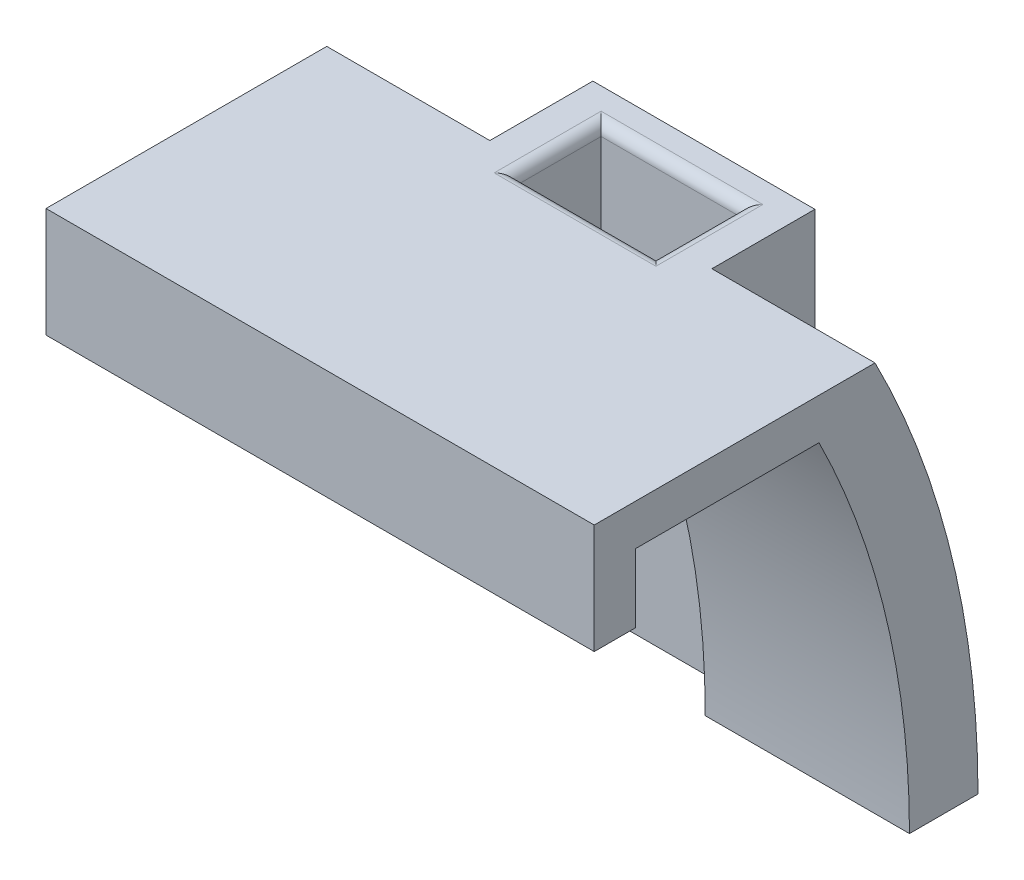
ISO-10303-21;
HEADER;
FILE_DESCRIPTION(('STEP AP214'),'2;1');
FILE_NAME('part.step','',(''),(''),'','','');
FILE_SCHEMA(('AUTOMOTIVE_DESIGN { 1 0 10303 214 1 1 1 1 }'));
ENDSEC;
DATA;
#1=APPLICATION_CONTEXT('core data for automotive mechanical design processes');
#2=APPLICATION_PROTOCOL_DEFINITION('international standard','automotive_design',2000,#1);
#3=PRODUCT_CONTEXT('',#1,'mechanical');
#4=PRODUCT('Part','Part','',(#3));
#5=PRODUCT_RELATED_PRODUCT_CATEGORY('part','',(#4));
#6=PRODUCT_DEFINITION_FORMATION('','',#4);
#7=PRODUCT_DEFINITION_CONTEXT('part definition',#1,'design');
#8=PRODUCT_DEFINITION('design','',#6,#7);
#9=PRODUCT_DEFINITION_SHAPE('','',#8);
#10=(LENGTH_UNIT() NAMED_UNIT(*) SI_UNIT(.MILLI.,.METRE.));
#11=(NAMED_UNIT(*) PLANE_ANGLE_UNIT() SI_UNIT($,.RADIAN.));
#12=(NAMED_UNIT(*) SI_UNIT($,.STERADIAN.) SOLID_ANGLE_UNIT());
#13=UNCERTAINTY_MEASURE_WITH_UNIT(LENGTH_MEASURE(1.E-05),#10,'distance_accuracy_value','');
#14=(GEOMETRIC_REPRESENTATION_CONTEXT(3) GLOBAL_UNCERTAINTY_ASSIGNED_CONTEXT((#13)) GLOBAL_UNIT_ASSIGNED_CONTEXT((#10,
#11,#12)) REPRESENTATION_CONTEXT('',''));
#15=CARTESIAN_POINT('',(0.,0.,0.));
#16=DIRECTION('',(0.,0.,1.));
#17=DIRECTION('',(1.,0.,0.));
#18=AXIS2_PLACEMENT_3D('',#15,#16,#17);
#19=CARTESIAN_POINT('',(25.4,-35.56,54.2213030303032));
#20=DIRECTION('',(-1.,0.,0.));
#21=DIRECTION('',(0.,0.,1.));
#22=AXIS2_PLACEMENT_3D('',#19,#20,#21);
#23=CYLINDRICAL_SURFACE('',#22,85.9713030303032);
#24=CARTESIAN_POINT('',(-10.287,-35.56,54.2213030303032));
#25=DIRECTION('',(1.,0.,0.));
#26=DIRECTION('',(0.,0.,-1.));
#27=AXIS2_PLACEMENT_3D('',#24,#25,#26);
#28=CIRCLE('',#27,85.9713030303032);
#29=CARTESIAN_POINT('',(-10.287,-35.56,-31.75));
#30=VERTEX_POINT('',#29);
#31=CARTESIAN_POINT('',(-10.287,3.81,-22.2055773504124));
#32=VERTEX_POINT('',#31);
#33=EDGE_CURVE('E281',#30,#32,#28,.T.);
#34=ORIENTED_EDGE('',*,*,#33,.F.);
#35=DIRECTION('',(-1.,0.,0.));
#36=VECTOR('',#35,1.);
#37=CARTESIAN_POINT('',(25.4,-35.56,-31.75));
#38=LINE('',#37,#36);
#39=CARTESIAN_POINT('',(-25.4,-35.56,-31.75));
#40=VERTEX_POINT('',#39);
#41=EDGE_CURVE('E272',#30,#40,#38,.T.);
#42=ORIENTED_EDGE('',*,*,#41,.T.);
#43=CARTESIAN_POINT('',(-25.4,-35.56,54.2213030303032));
#44=DIRECTION('',(1.,0.,0.));
#45=DIRECTION('',(0.,0.,-1.));
#46=AXIS2_PLACEMENT_3D('',#43,#44,#45);
#47=CIRCLE('',#46,85.9713030303032);
#48=CARTESIAN_POINT('',(-25.4,3.81,-22.2055773504124));
#49=VERTEX_POINT('',#48);
#50=EDGE_CURVE('E249',#40,#49,#47,.T.);
#51=ORIENTED_EDGE('',*,*,#50,.T.);
#52=DIRECTION('',(-1.,0.,0.));
#53=VECTOR('',#52,1.);
#54=CARTESIAN_POINT('',(25.4,3.81,-22.2055773504124));
#55=LINE('',#54,#53);
#56=EDGE_CURVE('E267',#32,#49,#55,.T.);
#57=ORIENTED_EDGE('',*,*,#56,.F.);
#58=EDGE_LOOP('',(#34,#42,#51,#57));
#59=FACE_BOUND('',#58,.T.);
#60=ADVANCED_FACE('F39',(#59),#23,.T.);
#61=CARTESIAN_POINT('',(25.4,0.,0.));
#62=DIRECTION('',(0.,1.,0.));
#63=DIRECTION('',(0.,0.,1.));
#64=AXIS2_PLACEMENT_3D('',#61,#62,#63);
#65=PLANE('',#64);
#66=DIRECTION('',(0.,0.,-1.));
#67=VECTOR('',#66,1.);
#68=CARTESIAN_POINT('',(-25.4,0.,0.));
#69=LINE('',#68,#67);
#70=CARTESIAN_POINT('',(-25.4,0.,0.));
#71=VERTEX_POINT('',#70);
#72=CARTESIAN_POINT('',(-25.4,0.,-17.018));
#73=VERTEX_POINT('',#72);
#74=EDGE_CURVE('E219',#71,#73,#69,.T.);
#75=ORIENTED_EDGE('',*,*,#74,.T.);
#76=DIRECTION('',(-1.,0.,0.));
#77=VECTOR('',#76,1.);
#78=CARTESIAN_POINT('',(25.4,0.,-17.018));
#79=LINE('',#78,#77);
#80=CARTESIAN_POINT('',(25.4,0.,-17.018));
#81=VERTEX_POINT('',#80);
#82=EDGE_CURVE('E276',#81,#73,#79,.T.);
#83=ORIENTED_EDGE('',*,*,#82,.F.);
#84=DIRECTION('',(0.,0.,-1.));
#85=VECTOR('',#84,1.);
#86=CARTESIAN_POINT('',(25.4,0.,0.));
#87=LINE('',#86,#85);
#88=CARTESIAN_POINT('',(25.4,0.,0.));
#89=VERTEX_POINT('',#88);
#90=EDGE_CURVE('E222',#89,#81,#87,.T.);
#91=ORIENTED_EDGE('',*,*,#90,.F.);
#92=DIRECTION('',(-1.,0.,0.));
#93=VECTOR('',#92,1.);
#94=CARTESIAN_POINT('',(25.4,0.,0.));
#95=LINE('',#94,#93);
#96=EDGE_CURVE('E239',#89,#71,#95,.T.);
#97=ORIENTED_EDGE('',*,*,#96,.T.);
#98=EDGE_LOOP('',(#75,#83,#91,#97));
#99=FACE_BOUND('',#98,.T.);
#100=ADVANCED_FACE('F334',(#99),#65,.F.);
#101=CARTESIAN_POINT('',(25.4,-35.56,54.2213030303032));
#102=DIRECTION('',(-1.,0.,0.));
#103=DIRECTION('',(0.,0.,1.));
#104=AXIS2_PLACEMENT_3D('',#101,#102,#103);
#105=CYLINDRICAL_SURFACE('',#104,79.6213030303032);
#106=DIRECTION('',(-1.,0.,0.));
#107=VECTOR('',#106,1.);
#108=CARTESIAN_POINT('',(25.4,-35.56,-25.4));
#109=LINE('',#108,#107);
#110=CARTESIAN_POINT('',(-6.477,-35.56,-25.4));
#111=VERTEX_POINT('',#110);
#112=CARTESIAN_POINT('',(-25.4,-35.56,-25.4));
#113=VERTEX_POINT('',#112);
#114=EDGE_CURVE('E280',#111,#113,#109,.T.);
#115=ORIENTED_EDGE('',*,*,#114,.F.);
#116=CARTESIAN_POINT('',(-6.477,-35.56,54.2213030303032));
#117=DIRECTION('',(-1.,0.,0.));
#118=DIRECTION('',(0.,0.,1.));
#119=AXIS2_PLACEMENT_3D('',#116,#117,#118);
#120=CIRCLE('',#119,79.6213030303032);
#121=CARTESIAN_POINT('',(-6.477,-8.96763246890016,-20.828));
#122=VERTEX_POINT('',#121);
#123=EDGE_CURVE('E203',#111,#122,#120,.F.);
#124=ORIENTED_EDGE('',*,*,#123,.T.);
#125=DIRECTION('',(-1.,0.,0.));
#126=VECTOR('',#125,1.);
#127=CARTESIAN_POINT('',(25.4,-8.96763246890016,-20.828));
#128=LINE('',#127,#126);
#129=CARTESIAN_POINT('',(6.477,-8.96763246890016,-20.828));
#130=VERTEX_POINT('',#129);
#131=EDGE_CURVE('E194',#122,#130,#128,.F.);
#132=ORIENTED_EDGE('',*,*,#131,.T.);
#133=CARTESIAN_POINT('',(6.477,-35.56,54.2213030303032));
#134=DIRECTION('',(1.,0.,0.));
#135=DIRECTION('',(0.,0.,-1.));
#136=AXIS2_PLACEMENT_3D('',#133,#134,#135);
#137=CIRCLE('',#136,79.6213030303032);
#138=CARTESIAN_POINT('',(6.477,-35.56,-25.4));
#139=VERTEX_POINT('',#138);
#140=EDGE_CURVE('E200',#130,#139,#137,.F.);
#141=ORIENTED_EDGE('',*,*,#140,.T.);
#142=CARTESIAN_POINT('',(25.4,-35.56,-25.4));
#143=VERTEX_POINT('',#142);
#144=EDGE_CURVE('E190',#143,#139,#109,.T.);
#145=ORIENTED_EDGE('',*,*,#144,.F.);
#146=CARTESIAN_POINT('',(25.4,-35.56,54.2213030303032));
#147=DIRECTION('',(-1.,0.,0.));
#148=DIRECTION('',(0.,0.,-1.));
#149=AXIS2_PLACEMENT_3D('',#146,#147,#148);
#150=CIRCLE('',#149,79.6213030303032);
#151=EDGE_CURVE('E221',#81,#143,#150,.T.);
#152=ORIENTED_EDGE('',*,*,#151,.F.);
#153=ORIENTED_EDGE('',*,*,#82,.T.);
#154=CARTESIAN_POINT('',(-25.4,-35.56,54.2213030303032));
#155=DIRECTION('',(-1.,0.,0.));
#156=DIRECTION('',(0.,0.,-1.));
#157=AXIS2_PLACEMENT_3D('',#154,#155,#156);
#158=CIRCLE('',#157,79.6213030303032);
#159=EDGE_CURVE('E241',#73,#113,#158,.T.);
#160=ORIENTED_EDGE('',*,*,#159,.T.);
#161=EDGE_LOOP('',(#115,#124,#132,#141,#145,#152,#153,#160));
#162=FACE_BOUND('',#161,.T.);
#163=ADVANCED_FACE('F342',(#162),#105,.F.);
#164=CARTESIAN_POINT('',(25.4,-35.56,-25.4));
#165=DIRECTION('',(0.,1.,0.));
#166=DIRECTION('',(0.,0.,1.));
#167=AXIS2_PLACEMENT_3D('',#164,#165,#166);
#168=PLANE('',#167);
#169=DIRECTION('',(-1.,0.,0.));
#170=VECTOR('',#169,1.);
#171=CARTESIAN_POINT('',(-6.477,-35.56,-28.702));
#172=LINE('',#171,#170);
#173=CARTESIAN_POINT('',(6.477,-35.56,-28.702));
#174=VERTEX_POINT('',#173);
#175=CARTESIAN_POINT('',(-6.477,-35.56,-28.702));
#176=VERTEX_POINT('',#175);
#177=EDGE_CURVE('E179',#174,#176,#172,.T.);
#178=ORIENTED_EDGE('',*,*,#177,.T.);
#179=DIRECTION('',(0.,0.,1.));
#180=VECTOR('',#179,1.);
#181=CARTESIAN_POINT('',(-6.477,-35.56,-28.702));
#182=LINE('',#181,#180);
#183=EDGE_CURVE('E188',#176,#111,#182,.T.);
#184=ORIENTED_EDGE('',*,*,#183,.T.);
#185=ORIENTED_EDGE('',*,*,#114,.T.);
#186=DIRECTION('',(0.,0.,-1.));
#187=VECTOR('',#186,1.);
#188=CARTESIAN_POINT('',(-25.4,-35.56,-25.4));
#189=LINE('',#188,#187);
#190=EDGE_CURVE('E242',#113,#40,#189,.T.);
#191=ORIENTED_EDGE('',*,*,#190,.T.);
#192=ORIENTED_EDGE('',*,*,#41,.F.);
#193=DIRECTION('',(-1.,0.,0.));
#194=VECTOR('',#193,1.);
#195=CARTESIAN_POINT('',(10.287,-35.56,-31.75));
#196=LINE('',#195,#194);
#197=CARTESIAN_POINT('',(10.287,-35.56,-31.75));
#198=VERTEX_POINT('',#197);
#199=EDGE_CURVE('E220',#198,#30,#196,.T.);
#200=ORIENTED_EDGE('',*,*,#199,.F.);
#201=CARTESIAN_POINT('',(25.4,-35.56,-31.75));
#202=VERTEX_POINT('',#201);
#203=EDGE_CURVE('E273',#202,#198,#38,.T.);
#204=ORIENTED_EDGE('',*,*,#203,.F.);
#205=DIRECTION('',(0.,0.,-1.));
#206=VECTOR('',#205,1.);
#207=CARTESIAN_POINT('',(25.4,-35.56,-25.4));
#208=LINE('',#207,#206);
#209=EDGE_CURVE('E226',#143,#202,#208,.T.);
#210=ORIENTED_EDGE('',*,*,#209,.F.);
#211=ORIENTED_EDGE('',*,*,#144,.T.);
#212=DIRECTION('',(0.,0.,-1.));
#213=VECTOR('',#212,1.);
#214=CARTESIAN_POINT('',(6.477,-35.56,-28.702));
#215=LINE('',#214,#213);
#216=EDGE_CURVE('E168',#139,#174,#215,.T.);
#217=ORIENTED_EDGE('',*,*,#216,.T.);
#218=EDGE_LOOP('',(#178,#184,#185,#191,#192,#200,#204,#210,#211,#217));
#219=FACE_BOUND('',#218,.T.);
#220=ADVANCED_FACE('F183',(#219),#168,.F.);
#221=ORIENTED_EDGE('',*,*,#203,.T.);
#222=CARTESIAN_POINT('',(10.287,-35.56,54.2213030303032));
#223=DIRECTION('',(1.,0.,0.));
#224=DIRECTION('',(0.,0.,-1.));
#225=AXIS2_PLACEMENT_3D('',#222,#223,#224);
#226=CIRCLE('',#225,85.9713030303032);
#227=CARTESIAN_POINT('',(10.287,3.81,-22.2055773504124));
#228=VERTEX_POINT('',#227);
#229=EDGE_CURVE('E282',#198,#228,#226,.T.);
#230=ORIENTED_EDGE('',*,*,#229,.T.);
#231=CARTESIAN_POINT('',(25.4,3.81,-22.2055773504124));
#232=VERTEX_POINT('',#231);
#233=EDGE_CURVE('E269',#232,#228,#55,.T.);
#234=ORIENTED_EDGE('',*,*,#233,.F.);
#235=CARTESIAN_POINT('',(25.4,-35.56,54.2213030303032));
#236=DIRECTION('',(1.,0.,0.));
#237=DIRECTION('',(0.,0.,-1.));
#238=AXIS2_PLACEMENT_3D('',#235,#236,#237);
#239=CIRCLE('',#238,85.9713030303032);
#240=EDGE_CURVE('E228',#202,#232,#239,.T.);
#241=ORIENTED_EDGE('',*,*,#240,.F.);
#242=EDGE_LOOP('',(#221,#230,#234,#241));
#243=FACE_BOUND('',#242,.T.);
#244=ADVANCED_FACE('F339',(#243),#23,.T.);
#245=CARTESIAN_POINT('',(25.4,3.81,3.81));
#246=DIRECTION('',(0.,-1.,0.));
#247=DIRECTION('',(0.,0.,-1.));
#248=AXIS2_PLACEMENT_3D('',#245,#246,#247);
#249=PLANE('',#248);
#250=DIRECTION('',(-1.,0.,0.));
#251=VECTOR('',#250,1.);
#252=CARTESIAN_POINT('',(25.4,3.81,-29.718));
#253=LINE('',#252,#251);
#254=CARTESIAN_POINT('',(-7.493,3.81,-29.718));
#255=VERTEX_POINT('',#254);
#256=CARTESIAN_POINT('',(7.493,3.81,-29.718));
#257=VERTEX_POINT('',#256);
#258=EDGE_CURVE('E289',#255,#257,#253,.F.);
#259=ORIENTED_EDGE('',*,*,#258,.T.);
#260=DIRECTION('',(0.,0.,-1.));
#261=VECTOR('',#260,1.);
#262=CARTESIAN_POINT('',(7.493,3.81,3.81));
#263=LINE('',#262,#261);
#264=CARTESIAN_POINT('',(7.493,3.81,-19.812));
#265=VERTEX_POINT('',#264);
#266=EDGE_CURVE('E294',#257,#265,#263,.F.);
#267=ORIENTED_EDGE('',*,*,#266,.T.);
#268=DIRECTION('',(1.,0.,0.));
#269=VECTOR('',#268,1.);
#270=CARTESIAN_POINT('',(25.4,3.81,-19.812));
#271=LINE('',#270,#269);
#272=CARTESIAN_POINT('',(-7.493,3.81,-19.812));
#273=VERTEX_POINT('',#272);
#274=EDGE_CURVE('E295',#265,#273,#271,.F.);
#275=ORIENTED_EDGE('',*,*,#274,.T.);
#276=DIRECTION('',(0.,0.,1.));
#277=VECTOR('',#276,1.);
#278=CARTESIAN_POINT('',(-7.49300000000001,3.81,3.81));
#279=LINE('',#278,#277);
#280=EDGE_CURVE('E290',#273,#255,#279,.F.);
#281=ORIENTED_EDGE('',*,*,#280,.T.);
#282=EDGE_LOOP('',(#259,#267,#275,#281));
#283=FACE_BOUND('',#282,.T.);
#284=DIRECTION('',(0.,0.,1.));
#285=VECTOR('',#284,1.);
#286=CARTESIAN_POINT('',(-25.4,3.81,3.81));
#287=LINE('',#286,#285);
#288=CARTESIAN_POINT('',(-25.4,3.81,3.81));
#289=VERTEX_POINT('',#288);
#290=EDGE_CURVE('E253',#49,#289,#287,.T.);
#291=ORIENTED_EDGE('',*,*,#290,.T.);
#292=DIRECTION('',(-1.,0.,0.));
#293=VECTOR('',#292,1.);
#294=CARTESIAN_POINT('',(25.4,3.81,3.81));
#295=LINE('',#294,#293);
#296=CARTESIAN_POINT('',(25.4,3.81,3.81));
#297=VERTEX_POINT('',#296);
#298=EDGE_CURVE('E266',#297,#289,#295,.T.);
#299=ORIENTED_EDGE('',*,*,#298,.F.);
#300=DIRECTION('',(0.,0.,1.));
#301=VECTOR('',#300,1.);
#302=CARTESIAN_POINT('',(25.4,3.81,3.81));
#303=LINE('',#302,#301);
#304=EDGE_CURVE('E231',#232,#297,#303,.T.);
#305=ORIENTED_EDGE('',*,*,#304,.F.);
#306=ORIENTED_EDGE('',*,*,#233,.T.);
#307=DIRECTION('',(0.,0.,1.));
#308=VECTOR('',#307,1.);
#309=CARTESIAN_POINT('',(10.287,3.81,-22.2055773504124));
#310=LINE('',#309,#308);
#311=CARTESIAN_POINT('',(10.287,3.81,-31.75));
#312=VERTEX_POINT('',#311);
#313=EDGE_CURVE('E210',#312,#228,#310,.T.);
#314=ORIENTED_EDGE('',*,*,#313,.F.);
#315=DIRECTION('',(-1.,0.,0.));
#316=VECTOR('',#315,1.);
#317=CARTESIAN_POINT('',(10.287,3.81,-31.75));
#318=LINE('',#317,#316);
#319=CARTESIAN_POINT('',(-10.287,3.81,-31.75));
#320=VERTEX_POINT('',#319);
#321=EDGE_CURVE('E211',#312,#320,#318,.T.);
#322=ORIENTED_EDGE('',*,*,#321,.T.);
#323=DIRECTION('',(0.,0.,1.));
#324=VECTOR('',#323,1.);
#325=CARTESIAN_POINT('',(-10.287,3.81,-22.2055773504124));
#326=LINE('',#325,#324);
#327=EDGE_CURVE('E208',#320,#32,#326,.T.);
#328=ORIENTED_EDGE('',*,*,#327,.T.);
#329=ORIENTED_EDGE('',*,*,#56,.T.);
#330=EDGE_LOOP('',(#291,#299,#305,#306,#314,#322,#328,#329));
#331=FACE_BOUND('',#330,.T.);
#332=ADVANCED_FACE('F318',(#283,#331),#249,.F.);
#333=CARTESIAN_POINT('',(25.4,-6.35,3.81));
#334=DIRECTION('',(0.,0.,-1.));
#335=DIRECTION('',(-1.,0.,0.));
#336=AXIS2_PLACEMENT_3D('',#333,#334,#335);
#337=PLANE('',#336);
#338=DIRECTION('',(0.,-1.,0.));
#339=VECTOR('',#338,1.);
#340=CARTESIAN_POINT('',(-25.4,-6.35,3.81));
#341=LINE('',#340,#339);
#342=CARTESIAN_POINT('',(-25.4,-6.35,3.81));
#343=VERTEX_POINT('',#342);
#344=EDGE_CURVE('E251',#289,#343,#341,.T.);
#345=ORIENTED_EDGE('',*,*,#344,.T.);
#346=DIRECTION('',(-1.,0.,0.));
#347=VECTOR('',#346,1.);
#348=CARTESIAN_POINT('',(25.4,-6.35,3.81));
#349=LINE('',#348,#347);
#350=CARTESIAN_POINT('',(25.4,-6.35,3.81));
#351=VERTEX_POINT('',#350);
#352=EDGE_CURVE('E263',#351,#343,#349,.T.);
#353=ORIENTED_EDGE('',*,*,#352,.F.);
#354=DIRECTION('',(0.,-1.,0.));
#355=VECTOR('',#354,1.);
#356=CARTESIAN_POINT('',(25.4,-6.35,3.81));
#357=LINE('',#356,#355);
#358=EDGE_CURVE('E234',#297,#351,#357,.T.);
#359=ORIENTED_EDGE('',*,*,#358,.F.);
#360=ORIENTED_EDGE('',*,*,#298,.T.);
#361=EDGE_LOOP('',(#345,#353,#359,#360));
#362=FACE_BOUND('',#361,.T.);
#363=ADVANCED_FACE('F351',(#362),#337,.F.);
#364=CARTESIAN_POINT('',(25.4,-6.35,0.));
#365=DIRECTION('',(0.,1.,0.));
#366=DIRECTION('',(0.,0.,1.));
#367=AXIS2_PLACEMENT_3D('',#364,#365,#366);
#368=PLANE('',#367);
#369=DIRECTION('',(0.,0.,-1.));
#370=VECTOR('',#369,1.);
#371=CARTESIAN_POINT('',(-25.4,-6.35,0.));
#372=LINE('',#371,#370);
#373=CARTESIAN_POINT('',(-25.4,-6.35,0.));
#374=VERTEX_POINT('',#373);
#375=EDGE_CURVE('E254',#343,#374,#372,.T.);
#376=ORIENTED_EDGE('',*,*,#375,.T.);
#377=DIRECTION('',(-1.,0.,0.));
#378=VECTOR('',#377,1.);
#379=CARTESIAN_POINT('',(25.4,-6.35,0.));
#380=LINE('',#379,#378);
#381=CARTESIAN_POINT('',(25.4,-6.35,0.));
#382=VERTEX_POINT('',#381);
#383=EDGE_CURVE('E257',#382,#374,#380,.T.);
#384=ORIENTED_EDGE('',*,*,#383,.F.);
#385=DIRECTION('',(0.,0.,-1.));
#386=VECTOR('',#385,1.);
#387=CARTESIAN_POINT('',(25.4,-6.35,0.));
#388=LINE('',#387,#386);
#389=EDGE_CURVE('E235',#351,#382,#388,.T.);
#390=ORIENTED_EDGE('',*,*,#389,.F.);
#391=ORIENTED_EDGE('',*,*,#352,.T.);
#392=EDGE_LOOP('',(#376,#384,#390,#391));
#393=FACE_BOUND('',#392,.T.);
#394=ADVANCED_FACE('F396',(#393),#368,.F.);
#395=CARTESIAN_POINT('',(25.4,0.,0.));
#396=DIRECTION('',(0.,0.,1.));
#397=DIRECTION('',(0.,-1.,0.));
#398=AXIS2_PLACEMENT_3D('',#395,#396,#397);
#399=PLANE('',#398);
#400=DIRECTION('',(0.,1.,0.));
#401=VECTOR('',#400,1.);
#402=CARTESIAN_POINT('',(-25.4,0.,0.));
#403=LINE('',#402,#401);
#404=EDGE_CURVE('E223',#374,#71,#403,.T.);
#405=ORIENTED_EDGE('',*,*,#404,.T.);
#406=ORIENTED_EDGE('',*,*,#96,.F.);
#407=DIRECTION('',(0.,1.,0.));
#408=VECTOR('',#407,1.);
#409=CARTESIAN_POINT('',(25.4,0.,0.));
#410=LINE('',#409,#408);
#411=EDGE_CURVE('E240',#382,#89,#410,.T.);
#412=ORIENTED_EDGE('',*,*,#411,.F.);
#413=ORIENTED_EDGE('',*,*,#383,.T.);
#414=EDGE_LOOP('',(#405,#406,#412,#413));
#415=FACE_BOUND('',#414,.T.);
#416=ADVANCED_FACE('F400',(#415),#399,.F.);
#417=CARTESIAN_POINT('',(25.4,-35.56,54.2213030303032));
#418=DIRECTION('',(1.,0.,0.));
#419=DIRECTION('',(0.,0.,-1.));
#420=AXIS2_PLACEMENT_3D('',#417,#418,#419);
#421=PLANE('',#420);
#422=ORIENTED_EDGE('',*,*,#90,.T.);
#423=ORIENTED_EDGE('',*,*,#151,.T.);
#424=ORIENTED_EDGE('',*,*,#209,.T.);
#425=ORIENTED_EDGE('',*,*,#240,.T.);
#426=ORIENTED_EDGE('',*,*,#304,.T.);
#427=ORIENTED_EDGE('',*,*,#358,.T.);
#428=ORIENTED_EDGE('',*,*,#389,.T.);
#429=ORIENTED_EDGE('',*,*,#411,.T.);
#430=EDGE_LOOP('',(#422,#423,#424,#425,#426,#427,#428,#429));
#431=FACE_BOUND('',#430,.T.);
#432=ADVANCED_FACE('F371',(#431),#421,.T.);
#433=CARTESIAN_POINT('',(-25.4,-35.56,54.2213030303032));
#434=DIRECTION('',(1.,0.,0.));
#435=DIRECTION('',(0.,0.,-1.));
#436=AXIS2_PLACEMENT_3D('',#433,#434,#435);
#437=PLANE('',#436);
#438=ORIENTED_EDGE('',*,*,#74,.F.);
#439=ORIENTED_EDGE('',*,*,#404,.F.);
#440=ORIENTED_EDGE('',*,*,#375,.F.);
#441=ORIENTED_EDGE('',*,*,#344,.F.);
#442=ORIENTED_EDGE('',*,*,#290,.F.);
#443=ORIENTED_EDGE('',*,*,#50,.F.);
#444=ORIENTED_EDGE('',*,*,#190,.F.);
#445=ORIENTED_EDGE('',*,*,#159,.F.);
#446=EDGE_LOOP('',(#438,#439,#440,#441,#442,#443,#444,#445));
#447=FACE_BOUND('',#446,.T.);
#448=ADVANCED_FACE('F390',(#447),#437,.F.);
#449=CARTESIAN_POINT('',(10.287,-35.56,-31.75));
#450=DIRECTION('',(0.,0.,1.));
#451=DIRECTION('',(1.,0.,0.));
#452=AXIS2_PLACEMENT_3D('',#449,#450,#451);
#453=PLANE('',#452);
#454=DIRECTION('',(0.,1.,0.));
#455=VECTOR('',#454,1.);
#456=CARTESIAN_POINT('',(-10.287,-35.56,-31.75));
#457=LINE('',#456,#455);
#458=EDGE_CURVE('E204',#30,#320,#457,.T.);
#459=ORIENTED_EDGE('',*,*,#458,.T.);
#460=ORIENTED_EDGE('',*,*,#321,.F.);
#461=DIRECTION('',(0.,1.,0.));
#462=VECTOR('',#461,1.);
#463=CARTESIAN_POINT('',(10.287,-35.56,-31.75));
#464=LINE('',#463,#462);
#465=EDGE_CURVE('E202',#198,#312,#464,.T.);
#466=ORIENTED_EDGE('',*,*,#465,.F.);
#467=ORIENTED_EDGE('',*,*,#199,.T.);
#468=EDGE_LOOP('',(#459,#460,#466,#467));
#469=FACE_BOUND('',#468,.T.);
#470=ADVANCED_FACE('F365',(#469),#453,.F.);
#471=CARTESIAN_POINT('',(10.287,0.,0.));
#472=DIRECTION('',(1.,0.,0.));
#473=DIRECTION('',(0.,0.,-1.));
#474=AXIS2_PLACEMENT_3D('',#471,#472,#473);
#475=PLANE('',#474);
#476=ORIENTED_EDGE('',*,*,#229,.F.);
#477=ORIENTED_EDGE('',*,*,#465,.T.);
#478=ORIENTED_EDGE('',*,*,#313,.T.);
#479=EDGE_LOOP('',(#476,#477,#478));
#480=FACE_BOUND('',#479,.T.);
#481=ADVANCED_FACE('F360',(#480),#475,.T.);
#482=CARTESIAN_POINT('',(-10.287,0.,0.));
#483=DIRECTION('',(1.,0.,0.));
#484=DIRECTION('',(0.,0.,-1.));
#485=AXIS2_PLACEMENT_3D('',#482,#483,#484);
#486=PLANE('',#485);
#487=ORIENTED_EDGE('',*,*,#458,.F.);
#488=ORIENTED_EDGE('',*,*,#33,.T.);
#489=ORIENTED_EDGE('',*,*,#327,.F.);
#490=EDGE_LOOP('',(#487,#488,#489));
#491=FACE_BOUND('',#490,.T.);
#492=ADVANCED_FACE('F388',(#491),#486,.F.);
#493=CARTESIAN_POINT('',(-6.477,-35.56,-28.702));
#494=DIRECTION('',(-1.,0.,0.));
#495=DIRECTION('',(0.,0.,1.));
#496=AXIS2_PLACEMENT_3D('',#493,#494,#495);
#497=PLANE('',#496);
#498=DIRECTION('',(0.,1.,0.));
#499=VECTOR('',#498,1.);
#500=CARTESIAN_POINT('',(-6.477,-35.56,-28.702));
#501=LINE('',#500,#499);
#502=CARTESIAN_POINT('',(-6.477,2.794,-28.702));
#503=VERTEX_POINT('',#502);
#504=EDGE_CURVE('E173',#176,#503,#501,.T.);
#505=ORIENTED_EDGE('',*,*,#504,.T.);
#506=DIRECTION('',(0.,0.,1.));
#507=VECTOR('',#506,1.);
#508=CARTESIAN_POINT('',(-6.477,2.794,-28.702));
#509=LINE('',#508,#507);
#510=CARTESIAN_POINT('',(-6.477,2.794,-20.828));
#511=VERTEX_POINT('',#510);
#512=EDGE_CURVE('E48',#503,#511,#509,.T.);
#513=ORIENTED_EDGE('',*,*,#512,.T.);
#514=DIRECTION('',(0.,1.,0.));
#515=VECTOR('',#514,1.);
#516=CARTESIAN_POINT('',(-6.477,-35.56,-20.828));
#517=LINE('',#516,#515);
#518=EDGE_CURVE('E185',#122,#511,#517,.T.);
#519=ORIENTED_EDGE('',*,*,#518,.F.);
#520=ORIENTED_EDGE('',*,*,#123,.F.);
#521=ORIENTED_EDGE('',*,*,#183,.F.);
#522=EDGE_LOOP('',(#505,#513,#519,#520,#521));
#523=FACE_BOUND('',#522,.T.);
#524=ADVANCED_FACE('F379',(#523),#497,.F.);
#525=CARTESIAN_POINT('',(6.477,-35.56,-28.702));
#526=DIRECTION('',(1.,0.,0.));
#527=DIRECTION('',(0.,0.,-1.));
#528=AXIS2_PLACEMENT_3D('',#525,#526,#527);
#529=PLANE('',#528);
#530=DIRECTION('',(0.,1.,0.));
#531=VECTOR('',#530,1.);
#532=CARTESIAN_POINT('',(6.477,-35.56,-20.828));
#533=LINE('',#532,#531);
#534=CARTESIAN_POINT('',(6.477,2.794,-20.828));
#535=VERTEX_POINT('',#534);
#536=EDGE_CURVE('E172',#130,#535,#533,.T.);
#537=ORIENTED_EDGE('',*,*,#536,.T.);
#538=DIRECTION('',(0.,0.,-1.));
#539=VECTOR('',#538,1.);
#540=CARTESIAN_POINT('',(6.477,2.794,-28.702));
#541=LINE('',#540,#539);
#542=CARTESIAN_POINT('',(6.477,2.794,-28.702));
#543=VERTEX_POINT('',#542);
#544=EDGE_CURVE('E175',#535,#543,#541,.T.);
#545=ORIENTED_EDGE('',*,*,#544,.T.);
#546=DIRECTION('',(0.,1.,0.));
#547=VECTOR('',#546,1.);
#548=CARTESIAN_POINT('',(6.477,-35.56,-28.702));
#549=LINE('',#548,#547);
#550=EDGE_CURVE('E164',#174,#543,#549,.T.);
#551=ORIENTED_EDGE('',*,*,#550,.F.);
#552=ORIENTED_EDGE('',*,*,#216,.F.);
#553=ORIENTED_EDGE('',*,*,#140,.F.);
#554=EDGE_LOOP('',(#537,#545,#551,#552,#553));
#555=FACE_BOUND('',#554,.T.);
#556=ADVANCED_FACE('F169',(#555),#529,.F.);
#557=CARTESIAN_POINT('',(-6.477,-35.56,-20.828));
#558=DIRECTION('',(0.,0.,1.));
#559=DIRECTION('',(1.,0.,0.));
#560=AXIS2_PLACEMENT_3D('',#557,#558,#559);
#561=PLANE('',#560);
#562=ORIENTED_EDGE('',*,*,#518,.T.);
#563=DIRECTION('',(1.,0.,0.));
#564=VECTOR('',#563,1.);
#565=CARTESIAN_POINT('',(-6.477,2.794,-20.828));
#566=LINE('',#565,#564);
#567=EDGE_CURVE('E296',#511,#535,#566,.T.);
#568=ORIENTED_EDGE('',*,*,#567,.T.);
#569=ORIENTED_EDGE('',*,*,#536,.F.);
#570=ORIENTED_EDGE('',*,*,#131,.F.);
#571=EDGE_LOOP('',(#562,#568,#569,#570));
#572=FACE_BOUND('',#571,.T.);
#573=ADVANCED_FACE('F377',(#572),#561,.F.);
#574=CARTESIAN_POINT('',(-6.477,-35.56,-28.702));
#575=DIRECTION('',(0.,0.,-1.));
#576=DIRECTION('',(-1.,0.,0.));
#577=AXIS2_PLACEMENT_3D('',#574,#575,#576);
#578=PLANE('',#577);
#579=ORIENTED_EDGE('',*,*,#550,.T.);
#580=DIRECTION('',(-1.,0.,0.));
#581=VECTOR('',#580,1.);
#582=CARTESIAN_POINT('',(-6.477,2.794,-28.702));
#583=LINE('',#582,#581);
#584=EDGE_CURVE('E11',#543,#503,#583,.T.);
#585=ORIENTED_EDGE('',*,*,#584,.T.);
#586=ORIENTED_EDGE('',*,*,#504,.F.);
#587=ORIENTED_EDGE('',*,*,#177,.F.);
#588=EDGE_LOOP('',(#579,#585,#586,#587));
#589=FACE_BOUND('',#588,.T.);
#590=ADVANCED_FACE('F178',(#589),#578,.F.);
#591=CARTESIAN_POINT('',(-7.493,2.794,-28.702));
#592=DIRECTION('',(0.,0.,1.));
#593=DIRECTION('',(0.,-1.,0.));
#594=AXIS2_PLACEMENT_3D('',#591,#592,#593);
#595=CYLINDRICAL_SURFACE('',#594,1.016);
#596=CARTESIAN_POINT('',(-7.493,2.794,-29.718));
#597=DIRECTION('',(-0.707106781186547,0.,0.707106781186547));
#598=DIRECTION('',(0.707106781186547,0.,0.707106781186547));
#599=AXIS2_PLACEMENT_3D('',#596,#597,#598);
#600=ELLIPSE('',#599,1.43684097937106,1.016);
#601=EDGE_CURVE('E304',#255,#503,#600,.F.);
#602=ORIENTED_EDGE('',*,*,#601,.F.);
#603=ORIENTED_EDGE('',*,*,#280,.F.);
#604=CARTESIAN_POINT('',(-7.493,2.794,-19.812));
#605=DIRECTION('',(0.707106781186547,0.,0.707106781186547));
#606=DIRECTION('',(0.707106781186547,0.,-0.707106781186547));
#607=AXIS2_PLACEMENT_3D('',#604,#605,#606);
#608=ELLIPSE('',#607,1.43684097937106,1.016);
#609=EDGE_CURVE('E43',#511,#273,#608,.T.);
#610=ORIENTED_EDGE('',*,*,#609,.F.);
#611=ORIENTED_EDGE('',*,*,#512,.F.);
#612=EDGE_LOOP('',(#602,#603,#610,#611));
#613=FACE_BOUND('',#612,.T.);
#614=ADVANCED_FACE('F41',(#613),#595,.T.);
#615=CARTESIAN_POINT('',(-6.477,2.794,-19.812));
#616=DIRECTION('',(1.,0.,0.));
#617=DIRECTION('',(0.,0.,-1.));
#618=AXIS2_PLACEMENT_3D('',#615,#616,#617);
#619=CYLINDRICAL_SURFACE('',#618,1.016);
#620=ORIENTED_EDGE('',*,*,#609,.T.);
#621=ORIENTED_EDGE('',*,*,#274,.F.);
#622=CARTESIAN_POINT('',(7.493,2.794,-19.812));
#623=DIRECTION('',(0.707106781186547,0.,-0.707106781186547));
#624=DIRECTION('',(-0.707106781186547,0.,-0.707106781186547));
#625=AXIS2_PLACEMENT_3D('',#622,#623,#624);
#626=ELLIPSE('',#625,1.43684097937106,1.016);
#627=EDGE_CURVE('E302',#535,#265,#626,.T.);
#628=ORIENTED_EDGE('',*,*,#627,.F.);
#629=ORIENTED_EDGE('',*,*,#567,.F.);
#630=EDGE_LOOP('',(#620,#621,#628,#629));
#631=FACE_BOUND('',#630,.T.);
#632=ADVANCED_FACE('F311',(#631),#619,.T.);
#633=CARTESIAN_POINT('',(-6.477,2.794,-29.718));
#634=DIRECTION('',(-1.,0.,0.));
#635=DIRECTION('',(0.,0.,1.));
#636=AXIS2_PLACEMENT_3D('',#633,#634,#635);
#637=CYLINDRICAL_SURFACE('',#636,1.016);
#638=ORIENTED_EDGE('',*,*,#601,.T.);
#639=ORIENTED_EDGE('',*,*,#584,.F.);
#640=CARTESIAN_POINT('',(7.493,2.794,-29.718));
#641=DIRECTION('',(-0.707106781186547,0.,-0.707106781186547));
#642=DIRECTION('',(0.707106781186547,0.,-0.707106781186547));
#643=AXIS2_PLACEMENT_3D('',#640,#641,#642);
#644=ELLIPSE('',#643,1.43684097937106,1.016);
#645=EDGE_CURVE('E297',#257,#543,#644,.F.);
#646=ORIENTED_EDGE('',*,*,#645,.F.);
#647=ORIENTED_EDGE('',*,*,#258,.F.);
#648=EDGE_LOOP('',(#638,#639,#646,#647));
#649=FACE_BOUND('',#648,.T.);
#650=ADVANCED_FACE('F322',(#649),#637,.T.);
#651=CARTESIAN_POINT('',(7.493,2.794,-28.702));
#652=DIRECTION('',(0.,0.,-1.));
#653=DIRECTION('',(0.,1.,0.));
#654=AXIS2_PLACEMENT_3D('',#651,#652,#653);
#655=CYLINDRICAL_SURFACE('',#654,1.016);
#656=ORIENTED_EDGE('',*,*,#627,.T.);
#657=ORIENTED_EDGE('',*,*,#266,.F.);
#658=ORIENTED_EDGE('',*,*,#645,.T.);
#659=ORIENTED_EDGE('',*,*,#544,.F.);
#660=EDGE_LOOP('',(#656,#657,#658,#659));
#661=FACE_BOUND('',#660,.T.);
#662=ADVANCED_FACE('F323',(#661),#655,.T.);
#663=CLOSED_SHELL('',(#60,#100,#163,#220,#244,#332,#363,#394,#416,#432,#448,#470,#481,#492,#524,
#556,#573,#590,#614,#632,#650,#662));
#664=MANIFOLD_SOLID_BREP('B2',#663);
#665=ADVANCED_BREP_SHAPE_REPRESENTATION('',(#18,#664),#14);
#666=SHAPE_DEFINITION_REPRESENTATION(#9,#665);
ENDSEC;
END-ISO-10303-21;
